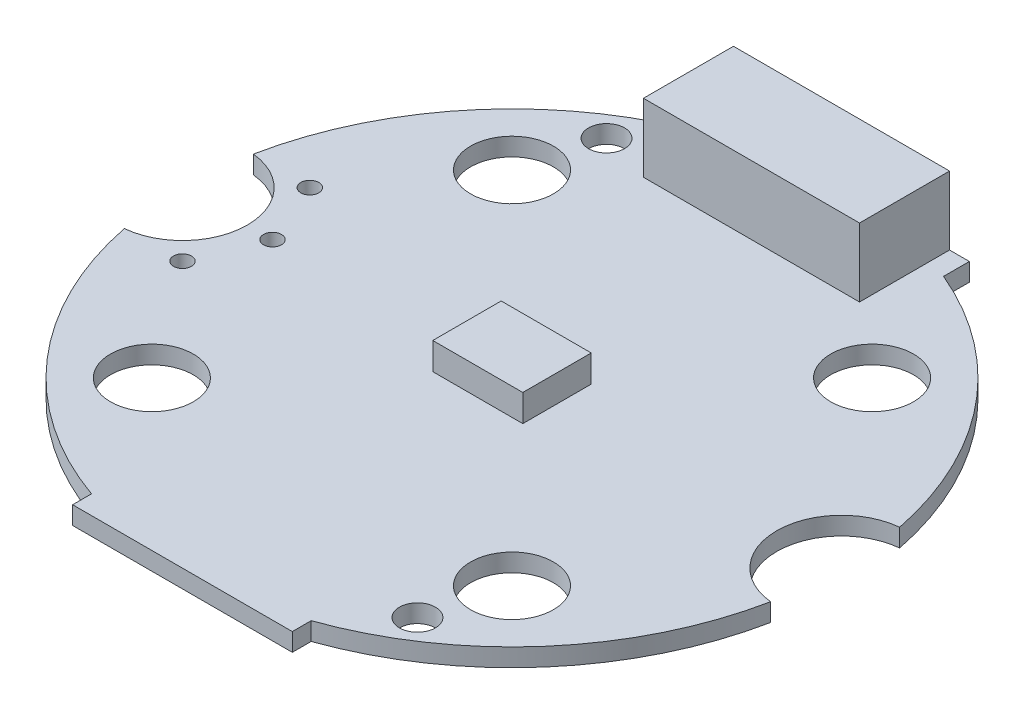
ISO-10303-21;
HEADER;
FILE_DESCRIPTION(('STEP AP214'),'2;1');
FILE_NAME('part.step','',(''),(''),'','','');
FILE_SCHEMA(('AUTOMOTIVE_DESIGN { 1 0 10303 214 1 1 1 1 }'));
ENDSEC;
DATA;
#1=APPLICATION_CONTEXT('core data for automotive mechanical design processes');
#2=APPLICATION_PROTOCOL_DEFINITION('international standard','automotive_design',2000,#1);
#3=PRODUCT_CONTEXT('',#1,'mechanical');
#4=PRODUCT('Part','Part','',(#3));
#5=PRODUCT_RELATED_PRODUCT_CATEGORY('part','',(#4));
#6=PRODUCT_DEFINITION_FORMATION('','',#4);
#7=PRODUCT_DEFINITION_CONTEXT('part definition',#1,'design');
#8=PRODUCT_DEFINITION('design','',#6,#7);
#9=PRODUCT_DEFINITION_SHAPE('','',#8);
#10=(LENGTH_UNIT() NAMED_UNIT(*) SI_UNIT(.MILLI.,.METRE.));
#11=(NAMED_UNIT(*) PLANE_ANGLE_UNIT() SI_UNIT($,.RADIAN.));
#12=(NAMED_UNIT(*) SI_UNIT($,.STERADIAN.) SOLID_ANGLE_UNIT());
#13=UNCERTAINTY_MEASURE_WITH_UNIT(LENGTH_MEASURE(1.E-05),#10,'distance_accuracy_value','');
#14=(GEOMETRIC_REPRESENTATION_CONTEXT(3) GLOBAL_UNCERTAINTY_ASSIGNED_CONTEXT((#13)) GLOBAL_UNIT_ASSIGNED_CONTEXT((#10,
#11,#12)) REPRESENTATION_CONTEXT('',''));
#15=CARTESIAN_POINT('',(0.,0.,0.));
#16=DIRECTION('',(0.,0.,1.));
#17=DIRECTION('',(1.,0.,0.));
#18=AXIS2_PLACEMENT_3D('',#15,#16,#17);
#19=CARTESIAN_POINT('',(0.,0.,0.));
#20=DIRECTION('',(0.,1.,0.));
#21=DIRECTION('',(0.,0.,1.));
#22=AXIS2_PLACEMENT_3D('',#19,#20,#21);
#23=PLANE('',#22);
#24=CARTESIAN_POINT('',(-13.3,0.,0.));
#25=DIRECTION('',(0.,-1.,0.));
#26=DIRECTION('',(0.,0.,-1.));
#27=AXIS2_PLACEMENT_3D('',#24,#25,#26);
#28=CIRCLE('',#27,0.500000000000001);
#29=CARTESIAN_POINT('',(-13.3,0.,-0.500000000000001));
#30=VERTEX_POINT('',#29);
#31=EDGE_CURVE('E400',#30,#30,#28,.T.);
#32=ORIENTED_EDGE('',*,*,#31,.F.);
#33=EDGE_LOOP('',(#32));
#34=FACE_BOUND('',#33,.T.);
#35=CARTESIAN_POINT('',(-14.7644660940673,0.,3.53553390593274));
#36=DIRECTION('',(0.,-1.,0.));
#37=DIRECTION('',(0.,0.,-1.));
#38=AXIS2_PLACEMENT_3D('',#35,#36,#37);
#39=CIRCLE('',#38,0.5);
#40=CARTESIAN_POINT('',(-14.7644660940673,0.,3.03553390593274));
#41=VERTEX_POINT('',#40);
#42=EDGE_CURVE('E766',#41,#41,#39,.T.);
#43=ORIENTED_EDGE('',*,*,#42,.F.);
#44=EDGE_LOOP('',(#43));
#45=FACE_BOUND('',#44,.T.);
#46=CARTESIAN_POINT('',(-14.7644660940673,0.,-3.53553390593274));
#47=DIRECTION('',(0.,-1.,0.));
#48=DIRECTION('',(0.,0.,-1.));
#49=AXIS2_PLACEMENT_3D('',#46,#47,#48);
#50=CIRCLE('',#49,0.500000000000001);
#51=CARTESIAN_POINT('',(-14.7644660940673,0.,-4.03553390593275));
#52=VERTEX_POINT('',#51);
#53=EDGE_CURVE('E767',#52,#52,#50,.T.);
#54=ORIENTED_EDGE('',*,*,#53,.F.);
#55=EDGE_LOOP('',(#54));
#56=FACE_BOUND('',#55,.T.);
#57=CARTESIAN_POINT('',(8.9,0.,14.15));
#58=DIRECTION('',(0.,1.,0.));
#59=DIRECTION('',(0.,0.,1.));
#60=AXIS2_PLACEMENT_3D('',#57,#58,#59);
#61=CIRCLE('',#60,0.999999999999999);
#62=CARTESIAN_POINT('',(8.9,0.,15.15));
#63=VERTEX_POINT('',#62);
#64=EDGE_CURVE('E396',#63,#63,#61,.T.);
#65=ORIENTED_EDGE('',*,*,#64,.T.);
#66=EDGE_LOOP('',(#65));
#67=FACE_BOUND('',#66,.T.);
#68=CARTESIAN_POINT('',(-8.9,0.,-14.15));
#69=DIRECTION('',(0.,1.,0.));
#70=DIRECTION('',(0.,0.,1.));
#71=AXIS2_PLACEMENT_3D('',#68,#69,#70);
#72=CIRCLE('',#71,0.999999999999999);
#73=CARTESIAN_POINT('',(-8.9,0.,-13.15));
#74=VERTEX_POINT('',#73);
#75=EDGE_CURVE('E392',#74,#74,#72,.T.);
#76=ORIENTED_EDGE('',*,*,#75,.T.);
#77=EDGE_LOOP('',(#76));
#78=FACE_BOUND('',#77,.T.);
#79=CARTESIAN_POINT('',(-9.99999999999943,0.,10.));
#80=DIRECTION('',(0.,1.,0.));
#81=DIRECTION('',(0.,0.,1.));
#82=AXIS2_PLACEMENT_3D('',#79,#80,#81);
#83=CIRCLE('',#82,2.3);
#84=CARTESIAN_POINT('',(-9.99999999999943,0.,12.3));
#85=VERTEX_POINT('',#84);
#86=EDGE_CURVE('E282',#85,#85,#83,.T.);
#87=ORIENTED_EDGE('',*,*,#86,.T.);
#88=EDGE_LOOP('',(#87));
#89=FACE_BOUND('',#88,.T.);
#90=CARTESIAN_POINT('',(10.0000000000006,0.,9.99999999999943));
#91=DIRECTION('',(0.,1.,0.));
#92=DIRECTION('',(0.,0.,1.));
#93=AXIS2_PLACEMENT_3D('',#90,#91,#92);
#94=CIRCLE('',#93,2.3);
#95=CARTESIAN_POINT('',(10.0000000000006,0.,12.2999999999994));
#96=VERTEX_POINT('',#95);
#97=EDGE_CURVE('E286',#96,#96,#94,.T.);
#98=ORIENTED_EDGE('',*,*,#97,.T.);
#99=EDGE_LOOP('',(#98));
#100=FACE_BOUND('',#99,.T.);
#101=CARTESIAN_POINT('',(10.,0.,-10.0000000000006));
#102=DIRECTION('',(0.,1.,0.));
#103=DIRECTION('',(0.,0.,1.));
#104=AXIS2_PLACEMENT_3D('',#101,#102,#103);
#105=CIRCLE('',#104,2.3);
#106=CARTESIAN_POINT('',(10.,0.,-7.70000000000057));
#107=VERTEX_POINT('',#106);
#108=EDGE_CURVE('E292',#107,#107,#105,.T.);
#109=ORIENTED_EDGE('',*,*,#108,.T.);
#110=EDGE_LOOP('',(#109));
#111=FACE_BOUND('',#110,.T.);
#112=CARTESIAN_POINT('',(-10.,0.,-10.));
#113=DIRECTION('',(0.,1.,0.));
#114=DIRECTION('',(0.,0.,1.));
#115=AXIS2_PLACEMENT_3D('',#112,#113,#114);
#116=CIRCLE('',#115,2.3);
#117=CARTESIAN_POINT('',(-10.,0.,-7.7));
#118=VERTEX_POINT('',#117);
#119=EDGE_CURVE('E298',#118,#118,#116,.T.);
#120=ORIENTED_EDGE('',*,*,#119,.T.);
#121=EDGE_LOOP('',(#120));
#122=FACE_BOUND('',#121,.T.);
#123=CARTESIAN_POINT('',(0.,0.,0.));
#124=DIRECTION('',(0.,1.,0.));
#125=DIRECTION('',(0.,0.,1.));
#126=AXIS2_PLACEMENT_3D('',#123,#124,#125);
#127=CIRCLE('',#126,18.3);
#128=CARTESIAN_POINT('',(6.1,0.,17.2534054609518));
#129=VERTEX_POINT('',#128);
#130=CARTESIAN_POINT('',(17.9459016393443,0.,3.58254300057667));
#131=VERTEX_POINT('',#130);
#132=EDGE_CURVE('E304',#129,#131,#127,.T.);
#133=ORIENTED_EDGE('',*,*,#132,.F.);
#134=DIRECTION('',(0.,0.,-1.));
#135=VECTOR('',#134,1.);
#136=CARTESIAN_POINT('',(6.1,0.,17.2534054609518));
#137=LINE('',#136,#135);
#138=CARTESIAN_POINT('',(6.1,0.,18.3));
#139=VERTEX_POINT('',#138);
#140=EDGE_CURVE('E311',#139,#129,#137,.T.);
#141=ORIENTED_EDGE('',*,*,#140,.F.);
#142=DIRECTION('',(1.,0.,0.));
#143=VECTOR('',#142,1.);
#144=CARTESIAN_POINT('',(6.1,0.,18.3));
#145=LINE('',#144,#143);
#146=CARTESIAN_POINT('',(-6.1,0.,18.3));
#147=VERTEX_POINT('',#146);
#148=EDGE_CURVE('E355',#147,#139,#145,.T.);
#149=ORIENTED_EDGE('',*,*,#148,.F.);
#150=DIRECTION('',(0.,0.,1.));
#151=VECTOR('',#150,1.);
#152=CARTESIAN_POINT('',(-6.1,0.,18.3));
#153=LINE('',#152,#151);
#154=CARTESIAN_POINT('',(-6.1,0.,17.2534054609518));
#155=VERTEX_POINT('',#154);
#156=EDGE_CURVE('E353',#155,#147,#153,.T.);
#157=ORIENTED_EDGE('',*,*,#156,.F.);
#158=CARTESIAN_POINT('',(0.,0.,0.));
#159=DIRECTION('',(0.,1.,0.));
#160=DIRECTION('',(0.,0.,1.));
#161=AXIS2_PLACEMENT_3D('',#158,#159,#160);
#162=CIRCLE('',#161,18.3);
#163=CARTESIAN_POINT('',(-17.9459016393443,0.,3.58254300057667));
#164=VERTEX_POINT('',#163);
#165=EDGE_CURVE('E351',#164,#155,#162,.T.);
#166=ORIENTED_EDGE('',*,*,#165,.F.);
#167=CARTESIAN_POINT('',(-18.3,0.,0.));
#168=DIRECTION('',(0.,-1.,0.));
#169=DIRECTION('',(0.,0.,1.));
#170=AXIS2_PLACEMENT_3D('',#167,#168,#169);
#171=CIRCLE('',#170,3.6);
#172=CARTESIAN_POINT('',(-17.9459016393443,0.,-3.58254300057668));
#173=VERTEX_POINT('',#172);
#174=EDGE_CURVE('E349',#173,#164,#171,.T.);
#175=ORIENTED_EDGE('',*,*,#174,.F.);
#176=CARTESIAN_POINT('',(0.,0.,0.));
#177=DIRECTION('',(0.,1.,0.));
#178=DIRECTION('',(0.,0.,1.));
#179=AXIS2_PLACEMENT_3D('',#176,#177,#178);
#180=CIRCLE('',#179,18.3);
#181=CARTESIAN_POINT('',(-7.1,0.,-16.8665349138464));
#182=VERTEX_POINT('',#181);
#183=EDGE_CURVE('E347',#182,#173,#180,.T.);
#184=ORIENTED_EDGE('',*,*,#183,.F.);
#185=DIRECTION('',(0.,0.,1.));
#186=VECTOR('',#185,1.);
#187=CARTESIAN_POINT('',(-7.1,0.,-18.3));
#188=LINE('',#187,#186);
#189=CARTESIAN_POINT('',(-7.1,0.,-18.3));
#190=VERTEX_POINT('',#189);
#191=EDGE_CURVE('E345',#190,#182,#188,.T.);
#192=ORIENTED_EDGE('',*,*,#191,.F.);
#193=DIRECTION('',(-1.,0.,0.));
#194=VECTOR('',#193,1.);
#195=CARTESIAN_POINT('',(-7.1,0.,-18.3));
#196=LINE('',#195,#194);
#197=CARTESIAN_POINT('',(7.1,0.,-18.3));
#198=VERTEX_POINT('',#197);
#199=EDGE_CURVE('E343',#198,#190,#196,.T.);
#200=ORIENTED_EDGE('',*,*,#199,.F.);
#201=DIRECTION('',(0.,0.,-1.));
#202=VECTOR('',#201,1.);
#203=CARTESIAN_POINT('',(7.1,0.,-18.3));
#204=LINE('',#203,#202);
#205=CARTESIAN_POINT('',(7.1,0.,-16.8665349138464));
#206=VERTEX_POINT('',#205);
#207=EDGE_CURVE('E341',#206,#198,#204,.T.);
#208=ORIENTED_EDGE('',*,*,#207,.F.);
#209=CARTESIAN_POINT('',(0.,0.,0.));
#210=DIRECTION('',(0.,1.,0.));
#211=DIRECTION('',(0.,0.,1.));
#212=AXIS2_PLACEMENT_3D('',#209,#210,#211);
#213=CIRCLE('',#212,18.3);
#214=CARTESIAN_POINT('',(17.9459016393443,0.,-3.58254300057667));
#215=VERTEX_POINT('',#214);
#216=EDGE_CURVE('E339',#215,#206,#213,.T.);
#217=ORIENTED_EDGE('',*,*,#216,.F.);
#218=CARTESIAN_POINT('',(18.3,0.,0.));
#219=DIRECTION('',(0.,-1.,0.));
#220=DIRECTION('',(0.,0.,1.));
#221=AXIS2_PLACEMENT_3D('',#218,#219,#220);
#222=CIRCLE('',#221,3.6);
#223=EDGE_CURVE('E337',#131,#215,#222,.T.);
#224=ORIENTED_EDGE('',*,*,#223,.F.);
#225=EDGE_LOOP('',(#133,#141,#149,#157,#166,#175,#184,#192,#200,#208,#217,#224));
#226=FACE_BOUND('',#225,.T.);
#227=DIRECTION('',(0.,0.,1.));
#228=VECTOR('',#227,1.);
#229=CARTESIAN_POINT('',(3.,0.,11.8));
#230=LINE('',#229,#228);
#231=CARTESIAN_POINT('',(3.,0.,4.7));
#232=VERTEX_POINT('',#231);
#233=CARTESIAN_POINT('',(3.,0.,11.8));
#234=VERTEX_POINT('',#233);
#235=EDGE_CURVE('E217',#232,#234,#230,.T.);
#236=ORIENTED_EDGE('',*,*,#235,.F.);
#237=DIRECTION('',(1.,0.,0.));
#238=VECTOR('',#237,1.);
#239=CARTESIAN_POINT('',(-3.,0.,4.7));
#240=LINE('',#239,#238);
#241=CARTESIAN_POINT('',(-3.,0.,4.7));
#242=VERTEX_POINT('',#241);
#243=EDGE_CURVE('E214',#242,#232,#240,.T.);
#244=ORIENTED_EDGE('',*,*,#243,.F.);
#245=DIRECTION('',(0.,0.,-1.));
#246=VECTOR('',#245,1.);
#247=CARTESIAN_POINT('',(-3.,0.,11.8));
#248=LINE('',#247,#246);
#249=CARTESIAN_POINT('',(-3.,0.,11.8));
#250=VERTEX_POINT('',#249);
#251=EDGE_CURVE('E56',#250,#242,#248,.T.);
#252=ORIENTED_EDGE('',*,*,#251,.F.);
#253=DIRECTION('',(-1.,0.,0.));
#254=VECTOR('',#253,1.);
#255=CARTESIAN_POINT('',(-3.,0.,11.8));
#256=LINE('',#255,#254);
#257=EDGE_CURVE('E51',#234,#250,#256,.T.);
#258=ORIENTED_EDGE('',*,*,#257,.F.);
#259=EDGE_LOOP('',(#236,#244,#252,#258));
#260=FACE_BOUND('',#259,.T.);
#261=ADVANCED_FACE('F34',(#34,#45,#56,#67,#78,#89,#100,#111,#122,#226,#260),#23,.F.);
#262=CARTESIAN_POINT('',(0.,1.,0.));
#263=DIRECTION('',(0.,1.,0.));
#264=DIRECTION('',(0.,0.,1.));
#265=AXIS2_PLACEMENT_3D('',#262,#263,#264);
#266=PLANE('',#265);
#267=CARTESIAN_POINT('',(-13.3,1.,0.));
#268=DIRECTION('',(0.,1.,0.));
#269=DIRECTION('',(0.,0.,1.));
#270=AXIS2_PLACEMENT_3D('',#267,#268,#269);
#271=CIRCLE('',#270,0.500000000000001);
#272=CARTESIAN_POINT('',(-13.3,1.,0.500000000000001));
#273=VERTEX_POINT('',#272);
#274=EDGE_CURVE('E38',#273,#273,#271,.T.);
#275=ORIENTED_EDGE('',*,*,#274,.F.);
#276=EDGE_LOOP('',(#275));
#277=FACE_BOUND('',#276,.T.);
#278=CARTESIAN_POINT('',(-14.7644660940673,1.,3.53553390593274));
#279=DIRECTION('',(0.,1.,0.));
#280=DIRECTION('',(0.,0.,1.));
#281=AXIS2_PLACEMENT_3D('',#278,#279,#280);
#282=CIRCLE('',#281,0.5);
#283=CARTESIAN_POINT('',(-14.7644660940673,1.,4.03553390593274));
#284=VERTEX_POINT('',#283);
#285=EDGE_CURVE('E399',#284,#284,#282,.T.);
#286=ORIENTED_EDGE('',*,*,#285,.F.);
#287=EDGE_LOOP('',(#286));
#288=FACE_BOUND('',#287,.T.);
#289=CARTESIAN_POINT('',(-14.7644660940673,1.,-3.53553390593274));
#290=DIRECTION('',(0.,1.,0.));
#291=DIRECTION('',(0.,0.,1.));
#292=AXIS2_PLACEMENT_3D('',#289,#290,#291);
#293=CIRCLE('',#292,0.500000000000001);
#294=CARTESIAN_POINT('',(-14.7644660940673,1.,-3.03553390593274));
#295=VERTEX_POINT('',#294);
#296=EDGE_CURVE('E397',#295,#295,#293,.T.);
#297=ORIENTED_EDGE('',*,*,#296,.F.);
#298=EDGE_LOOP('',(#297));
#299=FACE_BOUND('',#298,.T.);
#300=CARTESIAN_POINT('',(8.9,1.,14.15));
#301=DIRECTION('',(0.,1.,0.));
#302=DIRECTION('',(0.,0.,1.));
#303=AXIS2_PLACEMENT_3D('',#300,#301,#302);
#304=CIRCLE('',#303,0.999999999999999);
#305=CARTESIAN_POINT('',(8.9,1.,15.15));
#306=VERTEX_POINT('',#305);
#307=EDGE_CURVE('E393',#306,#306,#304,.T.);
#308=ORIENTED_EDGE('',*,*,#307,.F.);
#309=EDGE_LOOP('',(#308));
#310=FACE_BOUND('',#309,.T.);
#311=CARTESIAN_POINT('',(-8.9,1.,-14.15));
#312=DIRECTION('',(0.,1.,0.));
#313=DIRECTION('',(0.,0.,1.));
#314=AXIS2_PLACEMENT_3D('',#311,#312,#313);
#315=CIRCLE('',#314,0.999999999999999);
#316=CARTESIAN_POINT('',(-8.9,1.,-13.15));
#317=VERTEX_POINT('',#316);
#318=EDGE_CURVE('E389',#317,#317,#315,.T.);
#319=ORIENTED_EDGE('',*,*,#318,.F.);
#320=EDGE_LOOP('',(#319));
#321=FACE_BOUND('',#320,.T.);
#322=DIRECTION('',(0.,0.,1.));
#323=VECTOR('',#322,1.);
#324=CARTESIAN_POINT('',(-6.,1.,-18.3));
#325=LINE('',#324,#323);
#326=CARTESIAN_POINT('',(-6.,1.,-18.3));
#327=VERTEX_POINT('',#326);
#328=CARTESIAN_POINT('',(-6.,1.,-13.3));
#329=VERTEX_POINT('',#328);
#330=EDGE_CURVE('E252',#327,#329,#325,.T.);
#331=ORIENTED_EDGE('',*,*,#330,.F.);
#332=DIRECTION('',(-1.,0.,0.));
#333=VECTOR('',#332,1.);
#334=CARTESIAN_POINT('',(-7.1,1.,-18.3));
#335=LINE('',#334,#333);
#336=CARTESIAN_POINT('',(-7.1,1.,-18.3));
#337=VERTEX_POINT('',#336);
#338=EDGE_CURVE('E317',#327,#337,#335,.T.);
#339=ORIENTED_EDGE('',*,*,#338,.T.);
#340=DIRECTION('',(0.,0.,1.));
#341=VECTOR('',#340,1.);
#342=CARTESIAN_POINT('',(-7.1,1.,-18.3));
#343=LINE('',#342,#341);
#344=CARTESIAN_POINT('',(-7.1,1.,-16.8665349138464));
#345=VERTEX_POINT('',#344);
#346=EDGE_CURVE('E320',#337,#345,#343,.T.);
#347=ORIENTED_EDGE('',*,*,#346,.T.);
#348=CARTESIAN_POINT('',(0.,1.,0.));
#349=DIRECTION('',(0.,1.,0.));
#350=DIRECTION('',(0.,0.,1.));
#351=AXIS2_PLACEMENT_3D('',#348,#349,#350);
#352=CIRCLE('',#351,18.3);
#353=CARTESIAN_POINT('',(-17.9459016393443,1.,-3.58254300057668));
#354=VERTEX_POINT('',#353);
#355=EDGE_CURVE('E322',#345,#354,#352,.T.);
#356=ORIENTED_EDGE('',*,*,#355,.T.);
#357=CARTESIAN_POINT('',(-18.3,1.,0.));
#358=DIRECTION('',(0.,-1.,0.));
#359=DIRECTION('',(0.,0.,1.));
#360=AXIS2_PLACEMENT_3D('',#357,#358,#359);
#361=CIRCLE('',#360,3.6);
#362=CARTESIAN_POINT('',(-17.9459016393443,1.,3.58254300057667));
#363=VERTEX_POINT('',#362);
#364=EDGE_CURVE('E324',#354,#363,#361,.T.);
#365=ORIENTED_EDGE('',*,*,#364,.T.);
#366=CARTESIAN_POINT('',(0.,1.,0.));
#367=DIRECTION('',(0.,1.,0.));
#368=DIRECTION('',(0.,0.,1.));
#369=AXIS2_PLACEMENT_3D('',#366,#367,#368);
#370=CIRCLE('',#369,18.3);
#371=CARTESIAN_POINT('',(-6.1,1.,17.2534054609518));
#372=VERTEX_POINT('',#371);
#373=EDGE_CURVE('E326',#363,#372,#370,.T.);
#374=ORIENTED_EDGE('',*,*,#373,.T.);
#375=DIRECTION('',(0.,0.,1.));
#376=VECTOR('',#375,1.);
#377=CARTESIAN_POINT('',(-6.1,1.,18.3));
#378=LINE('',#377,#376);
#379=CARTESIAN_POINT('',(-6.1,1.,18.3));
#380=VERTEX_POINT('',#379);
#381=EDGE_CURVE('E328',#372,#380,#378,.T.);
#382=ORIENTED_EDGE('',*,*,#381,.T.);
#383=DIRECTION('',(1.,0.,0.));
#384=VECTOR('',#383,1.);
#385=CARTESIAN_POINT('',(6.1,1.,18.3));
#386=LINE('',#385,#384);
#387=CARTESIAN_POINT('',(6.1,1.,18.3));
#388=VERTEX_POINT('',#387);
#389=EDGE_CURVE('E330',#380,#388,#386,.T.);
#390=ORIENTED_EDGE('',*,*,#389,.T.);
#391=DIRECTION('',(0.,0.,-1.));
#392=VECTOR('',#391,1.);
#393=CARTESIAN_POINT('',(6.1,1.,17.2534054609518));
#394=LINE('',#393,#392);
#395=CARTESIAN_POINT('',(6.1,1.,17.2534054609518));
#396=VERTEX_POINT('',#395);
#397=EDGE_CURVE('E332',#388,#396,#394,.T.);
#398=ORIENTED_EDGE('',*,*,#397,.T.);
#399=CARTESIAN_POINT('',(0.,1.,0.));
#400=DIRECTION('',(0.,1.,0.));
#401=DIRECTION('',(0.,0.,1.));
#402=AXIS2_PLACEMENT_3D('',#399,#400,#401);
#403=CIRCLE('',#402,18.3);
#404=CARTESIAN_POINT('',(17.9459016393443,1.,3.58254300057667));
#405=VERTEX_POINT('',#404);
#406=EDGE_CURVE('E307',#396,#405,#403,.T.);
#407=ORIENTED_EDGE('',*,*,#406,.T.);
#408=CARTESIAN_POINT('',(18.3,1.,0.));
#409=DIRECTION('',(0.,-1.,0.));
#410=DIRECTION('',(0.,0.,1.));
#411=AXIS2_PLACEMENT_3D('',#408,#409,#410);
#412=CIRCLE('',#411,3.6);
#413=CARTESIAN_POINT('',(17.9459016393443,1.,-3.58254300057667));
#414=VERTEX_POINT('',#413);
#415=EDGE_CURVE('E310',#405,#414,#412,.T.);
#416=ORIENTED_EDGE('',*,*,#415,.T.);
#417=CARTESIAN_POINT('',(0.,1.,0.));
#418=DIRECTION('',(0.,1.,0.));
#419=DIRECTION('',(0.,0.,1.));
#420=AXIS2_PLACEMENT_3D('',#417,#418,#419);
#421=CIRCLE('',#420,18.3);
#422=CARTESIAN_POINT('',(7.1,1.,-16.8665349138464));
#423=VERTEX_POINT('',#422);
#424=EDGE_CURVE('E313',#414,#423,#421,.T.);
#425=ORIENTED_EDGE('',*,*,#424,.T.);
#426=DIRECTION('',(0.,0.,-1.));
#427=VECTOR('',#426,1.);
#428=CARTESIAN_POINT('',(7.1,1.,-18.3));
#429=LINE('',#428,#427);
#430=CARTESIAN_POINT('',(7.1,1.,-18.3));
#431=VERTEX_POINT('',#430);
#432=EDGE_CURVE('E315',#423,#431,#429,.T.);
#433=ORIENTED_EDGE('',*,*,#432,.T.);
#434=CARTESIAN_POINT('',(6.,1.,-18.3));
#435=VERTEX_POINT('',#434);
#436=EDGE_CURVE('E318',#431,#435,#335,.T.);
#437=ORIENTED_EDGE('',*,*,#436,.T.);
#438=DIRECTION('',(0.,0.,-1.));
#439=VECTOR('',#438,1.);
#440=CARTESIAN_POINT('',(6.,1.,-18.3));
#441=LINE('',#440,#439);
#442=CARTESIAN_POINT('',(6.,1.,-13.3));
#443=VERTEX_POINT('',#442);
#444=EDGE_CURVE('E257',#443,#435,#441,.T.);
#445=ORIENTED_EDGE('',*,*,#444,.F.);
#446=DIRECTION('',(1.,0.,0.));
#447=VECTOR('',#446,1.);
#448=CARTESIAN_POINT('',(-6.,1.,-13.3));
#449=LINE('',#448,#447);
#450=EDGE_CURVE('E266',#329,#443,#449,.T.);
#451=ORIENTED_EDGE('',*,*,#450,.F.);
#452=EDGE_LOOP('',(#331,#339,#347,#356,#365,#374,#382,#390,#398,#407,#416,#425,#433,#437,#445,#451));
#453=FACE_BOUND('',#452,.T.);
#454=CARTESIAN_POINT('',(10.0000000000006,1.,9.99999999999943));
#455=DIRECTION('',(0.,1.,0.));
#456=DIRECTION('',(0.,0.,1.));
#457=AXIS2_PLACEMENT_3D('',#454,#455,#456);
#458=CIRCLE('',#457,2.3);
#459=CARTESIAN_POINT('',(10.0000000000006,1.,12.2999999999994));
#460=VERTEX_POINT('',#459);
#461=EDGE_CURVE('E289',#460,#460,#458,.T.);
#462=ORIENTED_EDGE('',*,*,#461,.F.);
#463=EDGE_LOOP('',(#462));
#464=FACE_BOUND('',#463,.T.);
#465=CARTESIAN_POINT('',(-10.,1.,-10.));
#466=DIRECTION('',(0.,1.,0.));
#467=DIRECTION('',(0.,0.,1.));
#468=AXIS2_PLACEMENT_3D('',#465,#466,#467);
#469=CIRCLE('',#468,2.3);
#470=CARTESIAN_POINT('',(-10.,1.,-7.7));
#471=VERTEX_POINT('',#470);
#472=EDGE_CURVE('E301',#471,#471,#469,.T.);
#473=ORIENTED_EDGE('',*,*,#472,.F.);
#474=EDGE_LOOP('',(#473));
#475=FACE_BOUND('',#474,.T.);
#476=CARTESIAN_POINT('',(10.,1.,-10.0000000000006));
#477=DIRECTION('',(0.,1.,0.));
#478=DIRECTION('',(0.,0.,1.));
#479=AXIS2_PLACEMENT_3D('',#476,#477,#478);
#480=CIRCLE('',#479,2.3);
#481=CARTESIAN_POINT('',(10.,1.,-7.70000000000057));
#482=VERTEX_POINT('',#481);
#483=EDGE_CURVE('E295',#482,#482,#480,.T.);
#484=ORIENTED_EDGE('',*,*,#483,.F.);
#485=EDGE_LOOP('',(#484));
#486=FACE_BOUND('',#485,.T.);
#487=CARTESIAN_POINT('',(-9.99999999999943,1.,10.));
#488=DIRECTION('',(0.,1.,0.));
#489=DIRECTION('',(0.,0.,1.));
#490=AXIS2_PLACEMENT_3D('',#487,#488,#489);
#491=CIRCLE('',#490,2.3);
#492=CARTESIAN_POINT('',(-9.99999999999943,1.,12.3));
#493=VERTEX_POINT('',#492);
#494=EDGE_CURVE('E283',#493,#493,#491,.T.);
#495=ORIENTED_EDGE('',*,*,#494,.F.);
#496=EDGE_LOOP('',(#495));
#497=FACE_BOUND('',#496,.T.);
#498=DIRECTION('',(-1.,0.,0.));
#499=VECTOR('',#498,1.);
#500=CARTESIAN_POINT('',(-2.5,1.,-1.9));
#501=LINE('',#500,#499);
#502=CARTESIAN_POINT('',(2.5,1.,-1.9));
#503=VERTEX_POINT('',#502);
#504=CARTESIAN_POINT('',(-2.5,1.,-1.9));
#505=VERTEX_POINT('',#504);
#506=EDGE_CURVE('E221',#503,#505,#501,.T.);
#507=ORIENTED_EDGE('',*,*,#506,.F.);
#508=DIRECTION('',(0.,0.,-1.));
#509=VECTOR('',#508,1.);
#510=CARTESIAN_POINT('',(2.5,1.,-1.9));
#511=LINE('',#510,#509);
#512=CARTESIAN_POINT('',(2.5,1.,1.9));
#513=VERTEX_POINT('',#512);
#514=EDGE_CURVE('E218',#513,#503,#511,.T.);
#515=ORIENTED_EDGE('',*,*,#514,.F.);
#516=DIRECTION('',(1.,0.,0.));
#517=VECTOR('',#516,1.);
#518=CARTESIAN_POINT('',(-2.5,1.,1.9));
#519=LINE('',#518,#517);
#520=CARTESIAN_POINT('',(-2.5,1.,1.9));
#521=VERTEX_POINT('',#520);
#522=EDGE_CURVE('E231',#521,#513,#519,.T.);
#523=ORIENTED_EDGE('',*,*,#522,.F.);
#524=DIRECTION('',(0.,0.,1.));
#525=VECTOR('',#524,1.);
#526=CARTESIAN_POINT('',(-2.5,1.,-1.9));
#527=LINE('',#526,#525);
#528=EDGE_CURVE('E239',#505,#521,#527,.T.);
#529=ORIENTED_EDGE('',*,*,#528,.F.);
#530=EDGE_LOOP('',(#507,#515,#523,#529));
#531=FACE_BOUND('',#530,.T.);
#532=ADVANCED_FACE('F410',(#277,#288,#299,#310,#321,#453,#464,#475,#486,#497,#531),#266,.T.);
#533=CARTESIAN_POINT('',(0.,1.,0.));
#534=DIRECTION('',(0.,-1.,0.));
#535=DIRECTION('',(0.,0.,-1.));
#536=AXIS2_PLACEMENT_3D('',#533,#534,#535);
#537=CYLINDRICAL_SURFACE('',#536,18.3);
#538=ORIENTED_EDGE('',*,*,#132,.T.);
#539=DIRECTION('',(0.,-1.,0.));
#540=VECTOR('',#539,1.);
#541=CARTESIAN_POINT('',(17.9459016393443,1.,3.58254300057667));
#542=LINE('',#541,#540);
#543=EDGE_CURVE('E11',#405,#131,#542,.T.);
#544=ORIENTED_EDGE('',*,*,#543,.F.);
#545=ORIENTED_EDGE('',*,*,#406,.F.);
#546=DIRECTION('',(0.,-1.,0.));
#547=VECTOR('',#546,1.);
#548=CARTESIAN_POINT('',(6.1,1.,17.2534054609518));
#549=LINE('',#548,#547);
#550=EDGE_CURVE('E334',#396,#129,#549,.T.);
#551=ORIENTED_EDGE('',*,*,#550,.T.);
#552=EDGE_LOOP('',(#538,#544,#545,#551));
#553=FACE_BOUND('',#552,.T.);
#554=ADVANCED_FACE('F36',(#553),#537,.T.);
#555=CARTESIAN_POINT('',(18.3,1.,0.));
#556=DIRECTION('',(0.,-1.,0.));
#557=DIRECTION('',(0.,0.,-1.));
#558=AXIS2_PLACEMENT_3D('',#555,#556,#557);
#559=CYLINDRICAL_SURFACE('',#558,3.6);
#560=ORIENTED_EDGE('',*,*,#223,.T.);
#561=DIRECTION('',(0.,-1.,0.));
#562=VECTOR('',#561,1.);
#563=CARTESIAN_POINT('',(17.9459016393443,1.,-3.58254300057667));
#564=LINE('',#563,#562);
#565=EDGE_CURVE('E43',#414,#215,#564,.T.);
#566=ORIENTED_EDGE('',*,*,#565,.F.);
#567=ORIENTED_EDGE('',*,*,#415,.F.);
#568=ORIENTED_EDGE('',*,*,#543,.T.);
#569=EDGE_LOOP('',(#560,#566,#567,#568));
#570=FACE_BOUND('',#569,.T.);
#571=ADVANCED_FACE('F508',(#570),#559,.F.);
#572=CARTESIAN_POINT('',(0.,1.,0.));
#573=DIRECTION('',(0.,-1.,0.));
#574=DIRECTION('',(0.,0.,-1.));
#575=AXIS2_PLACEMENT_3D('',#572,#573,#574);
#576=CYLINDRICAL_SURFACE('',#575,18.3);
#577=ORIENTED_EDGE('',*,*,#216,.T.);
#578=DIRECTION('',(0.,-1.,0.));
#579=VECTOR('',#578,1.);
#580=CARTESIAN_POINT('',(7.1,1.,-16.8665349138464));
#581=LINE('',#580,#579);
#582=EDGE_CURVE('E384',#423,#206,#581,.T.);
#583=ORIENTED_EDGE('',*,*,#582,.F.);
#584=ORIENTED_EDGE('',*,*,#424,.F.);
#585=ORIENTED_EDGE('',*,*,#565,.T.);
#586=EDGE_LOOP('',(#577,#583,#584,#585));
#587=FACE_BOUND('',#586,.T.);
#588=ADVANCED_FACE('F505',(#587),#576,.T.);
#589=CARTESIAN_POINT('',(7.1,1.,-18.3));
#590=DIRECTION('',(-1.,0.,0.));
#591=DIRECTION('',(0.,0.,1.));
#592=AXIS2_PLACEMENT_3D('',#589,#590,#591);
#593=PLANE('',#592);
#594=ORIENTED_EDGE('',*,*,#207,.T.);
#595=DIRECTION('',(0.,-1.,0.));
#596=VECTOR('',#595,1.);
#597=CARTESIAN_POINT('',(7.1,1.,-18.3));
#598=LINE('',#597,#596);
#599=EDGE_CURVE('E381',#431,#198,#598,.T.);
#600=ORIENTED_EDGE('',*,*,#599,.F.);
#601=ORIENTED_EDGE('',*,*,#432,.F.);
#602=ORIENTED_EDGE('',*,*,#582,.T.);
#603=EDGE_LOOP('',(#594,#600,#601,#602));
#604=FACE_BOUND('',#603,.T.);
#605=ADVANCED_FACE('F501',(#604),#593,.F.);
#606=CARTESIAN_POINT('',(-7.1,1.,-18.3));
#607=DIRECTION('',(0.,0.,1.));
#608=DIRECTION('',(1.,0.,0.));
#609=AXIS2_PLACEMENT_3D('',#606,#607,#608);
#610=PLANE('',#609);
#611=ORIENTED_EDGE('',*,*,#199,.T.);
#612=DIRECTION('',(0.,-1.,0.));
#613=VECTOR('',#612,1.);
#614=CARTESIAN_POINT('',(-7.1,1.,-18.3));
#615=LINE('',#614,#613);
#616=EDGE_CURVE('E378',#337,#190,#615,.T.);
#617=ORIENTED_EDGE('',*,*,#616,.F.);
#618=ORIENTED_EDGE('',*,*,#338,.F.);
#619=DIRECTION('',(0.,-1.,0.));
#620=VECTOR('',#619,1.);
#621=CARTESIAN_POINT('',(-6.,4.8,-18.3));
#622=LINE('',#621,#620);
#623=CARTESIAN_POINT('',(-6.,4.8,-18.3));
#624=VERTEX_POINT('',#623);
#625=EDGE_CURVE('E263',#624,#327,#622,.T.);
#626=ORIENTED_EDGE('',*,*,#625,.F.);
#627=DIRECTION('',(-1.,0.,0.));
#628=VECTOR('',#627,1.);
#629=CARTESIAN_POINT('',(-6.,4.8,-18.3));
#630=LINE('',#629,#628);
#631=CARTESIAN_POINT('',(6.,4.8,-18.3));
#632=VERTEX_POINT('',#631);
#633=EDGE_CURVE('E261',#632,#624,#630,.T.);
#634=ORIENTED_EDGE('',*,*,#633,.F.);
#635=DIRECTION('',(0.,-1.,0.));
#636=VECTOR('',#635,1.);
#637=CARTESIAN_POINT('',(6.,4.8,-18.3));
#638=LINE('',#637,#636);
#639=EDGE_CURVE('E273',#632,#435,#638,.T.);
#640=ORIENTED_EDGE('',*,*,#639,.T.);
#641=ORIENTED_EDGE('',*,*,#436,.F.);
#642=ORIENTED_EDGE('',*,*,#599,.T.);
#643=EDGE_LOOP('',(#611,#617,#618,#626,#634,#640,#641,#642));
#644=FACE_BOUND('',#643,.T.);
#645=ADVANCED_FACE('F497',(#644),#610,.F.);
#646=CARTESIAN_POINT('',(-7.1,1.,-18.3));
#647=DIRECTION('',(1.,0.,0.));
#648=DIRECTION('',(0.,0.,-1.));
#649=AXIS2_PLACEMENT_3D('',#646,#647,#648);
#650=PLANE('',#649);
#651=ORIENTED_EDGE('',*,*,#191,.T.);
#652=DIRECTION('',(0.,-1.,0.));
#653=VECTOR('',#652,1.);
#654=CARTESIAN_POINT('',(-7.1,1.,-16.8665349138464));
#655=LINE('',#654,#653);
#656=EDGE_CURVE('E375',#345,#182,#655,.T.);
#657=ORIENTED_EDGE('',*,*,#656,.F.);
#658=ORIENTED_EDGE('',*,*,#346,.F.);
#659=ORIENTED_EDGE('',*,*,#616,.T.);
#660=EDGE_LOOP('',(#651,#657,#658,#659));
#661=FACE_BOUND('',#660,.T.);
#662=ADVANCED_FACE('F493',(#661),#650,.F.);
#663=CARTESIAN_POINT('',(0.,1.,0.));
#664=DIRECTION('',(0.,-1.,0.));
#665=DIRECTION('',(0.,0.,-1.));
#666=AXIS2_PLACEMENT_3D('',#663,#664,#665);
#667=CYLINDRICAL_SURFACE('',#666,18.3);
#668=ORIENTED_EDGE('',*,*,#183,.T.);
#669=DIRECTION('',(0.,-1.,0.));
#670=VECTOR('',#669,1.);
#671=CARTESIAN_POINT('',(-17.9459016393443,1.,-3.58254300057668));
#672=LINE('',#671,#670);
#673=EDGE_CURVE('E372',#354,#173,#672,.T.);
#674=ORIENTED_EDGE('',*,*,#673,.F.);
#675=ORIENTED_EDGE('',*,*,#355,.F.);
#676=ORIENTED_EDGE('',*,*,#656,.T.);
#677=EDGE_LOOP('',(#668,#674,#675,#676));
#678=FACE_BOUND('',#677,.T.);
#679=ADVANCED_FACE('F489',(#678),#667,.T.);
#680=CARTESIAN_POINT('',(-18.3,1.,0.));
#681=DIRECTION('',(0.,-1.,0.));
#682=DIRECTION('',(0.,0.,-1.));
#683=AXIS2_PLACEMENT_3D('',#680,#681,#682);
#684=CYLINDRICAL_SURFACE('',#683,3.6);
#685=ORIENTED_EDGE('',*,*,#174,.T.);
#686=DIRECTION('',(0.,-1.,0.));
#687=VECTOR('',#686,1.);
#688=CARTESIAN_POINT('',(-17.9459016393443,1.,3.58254300057667));
#689=LINE('',#688,#687);
#690=EDGE_CURVE('E369',#363,#164,#689,.T.);
#691=ORIENTED_EDGE('',*,*,#690,.F.);
#692=ORIENTED_EDGE('',*,*,#364,.F.);
#693=ORIENTED_EDGE('',*,*,#673,.T.);
#694=EDGE_LOOP('',(#685,#691,#692,#693));
#695=FACE_BOUND('',#694,.T.);
#696=ADVANCED_FACE('F485',(#695),#684,.F.);
#697=CARTESIAN_POINT('',(0.,1.,0.));
#698=DIRECTION('',(0.,-1.,0.));
#699=DIRECTION('',(0.,0.,-1.));
#700=AXIS2_PLACEMENT_3D('',#697,#698,#699);
#701=CYLINDRICAL_SURFACE('',#700,18.3);
#702=ORIENTED_EDGE('',*,*,#165,.T.);
#703=DIRECTION('',(0.,-1.,0.));
#704=VECTOR('',#703,1.);
#705=CARTESIAN_POINT('',(-6.1,1.,17.2534054609518));
#706=LINE('',#705,#704);
#707=EDGE_CURVE('E366',#372,#155,#706,.T.);
#708=ORIENTED_EDGE('',*,*,#707,.F.);
#709=ORIENTED_EDGE('',*,*,#373,.F.);
#710=ORIENTED_EDGE('',*,*,#690,.T.);
#711=EDGE_LOOP('',(#702,#708,#709,#710));
#712=FACE_BOUND('',#711,.T.);
#713=ADVANCED_FACE('F481',(#712),#701,.T.);
#714=CARTESIAN_POINT('',(-6.1,1.,18.3));
#715=DIRECTION('',(1.,0.,0.));
#716=DIRECTION('',(0.,0.,-1.));
#717=AXIS2_PLACEMENT_3D('',#714,#715,#716);
#718=PLANE('',#717);
#719=ORIENTED_EDGE('',*,*,#156,.T.);
#720=DIRECTION('',(0.,-1.,0.));
#721=VECTOR('',#720,1.);
#722=CARTESIAN_POINT('',(-6.1,1.,18.3));
#723=LINE('',#722,#721);
#724=EDGE_CURVE('E363',#380,#147,#723,.T.);
#725=ORIENTED_EDGE('',*,*,#724,.F.);
#726=ORIENTED_EDGE('',*,*,#381,.F.);
#727=ORIENTED_EDGE('',*,*,#707,.T.);
#728=EDGE_LOOP('',(#719,#725,#726,#727));
#729=FACE_BOUND('',#728,.T.);
#730=ADVANCED_FACE('F477',(#729),#718,.F.);
#731=CARTESIAN_POINT('',(6.1,1.,18.3));
#732=DIRECTION('',(0.,0.,-1.));
#733=DIRECTION('',(-1.,0.,0.));
#734=AXIS2_PLACEMENT_3D('',#731,#732,#733);
#735=PLANE('',#734);
#736=ORIENTED_EDGE('',*,*,#148,.T.);
#737=DIRECTION('',(0.,-1.,0.));
#738=VECTOR('',#737,1.);
#739=CARTESIAN_POINT('',(6.1,1.,18.3));
#740=LINE('',#739,#738);
#741=EDGE_CURVE('E360',#388,#139,#740,.T.);
#742=ORIENTED_EDGE('',*,*,#741,.F.);
#743=ORIENTED_EDGE('',*,*,#389,.F.);
#744=ORIENTED_EDGE('',*,*,#724,.T.);
#745=EDGE_LOOP('',(#736,#742,#743,#744));
#746=FACE_BOUND('',#745,.T.);
#747=ADVANCED_FACE('F473',(#746),#735,.F.);
#748=CARTESIAN_POINT('',(6.1,1.,17.2534054609518));
#749=DIRECTION('',(-1.,0.,0.));
#750=DIRECTION('',(0.,0.,1.));
#751=AXIS2_PLACEMENT_3D('',#748,#749,#750);
#752=PLANE('',#751);
#753=ORIENTED_EDGE('',*,*,#140,.T.);
#754=ORIENTED_EDGE('',*,*,#550,.F.);
#755=ORIENTED_EDGE('',*,*,#397,.F.);
#756=ORIENTED_EDGE('',*,*,#741,.T.);
#757=EDGE_LOOP('',(#753,#754,#755,#756));
#758=FACE_BOUND('',#757,.T.);
#759=ADVANCED_FACE('F469',(#758),#752,.F.);
#760=CARTESIAN_POINT('',(-10.,1.,-10.));
#761=DIRECTION('',(0.,-1.,0.));
#762=DIRECTION('',(0.,0.,-1.));
#763=AXIS2_PLACEMENT_3D('',#760,#761,#762);
#764=CYLINDRICAL_SURFACE('',#763,2.3);
#765=ORIENTED_EDGE('',*,*,#472,.T.);
#766=EDGE_LOOP('',(#765));
#767=FACE_BOUND('',#766,.T.);
#768=ORIENTED_EDGE('',*,*,#119,.F.);
#769=EDGE_LOOP('',(#768));
#770=FACE_BOUND('',#769,.T.);
#771=ADVANCED_FACE('F472',(#767,#770),#764,.F.);
#772=CARTESIAN_POINT('',(10.,1.,-10.0000000000006));
#773=DIRECTION('',(0.,-1.,0.));
#774=DIRECTION('',(0.,0.,-1.));
#775=AXIS2_PLACEMENT_3D('',#772,#773,#774);
#776=CYLINDRICAL_SURFACE('',#775,2.3);
#777=ORIENTED_EDGE('',*,*,#483,.T.);
#778=EDGE_LOOP('',(#777));
#779=FACE_BOUND('',#778,.T.);
#780=ORIENTED_EDGE('',*,*,#108,.F.);
#781=EDGE_LOOP('',(#780));
#782=FACE_BOUND('',#781,.T.);
#783=ADVANCED_FACE('F587',(#779,#782),#776,.F.);
#784=CARTESIAN_POINT('',(10.0000000000006,1.,9.99999999999943));
#785=DIRECTION('',(0.,-1.,0.));
#786=DIRECTION('',(0.,0.,-1.));
#787=AXIS2_PLACEMENT_3D('',#784,#785,#786);
#788=CYLINDRICAL_SURFACE('',#787,2.3);
#789=ORIENTED_EDGE('',*,*,#461,.T.);
#790=EDGE_LOOP('',(#789));
#791=FACE_BOUND('',#790,.T.);
#792=ORIENTED_EDGE('',*,*,#97,.F.);
#793=EDGE_LOOP('',(#792));
#794=FACE_BOUND('',#793,.T.);
#795=ADVANCED_FACE('F583',(#791,#794),#788,.F.);
#796=CARTESIAN_POINT('',(-9.99999999999943,1.,10.));
#797=DIRECTION('',(0.,-1.,0.));
#798=DIRECTION('',(0.,0.,-1.));
#799=AXIS2_PLACEMENT_3D('',#796,#797,#798);
#800=CYLINDRICAL_SURFACE('',#799,2.3);
#801=ORIENTED_EDGE('',*,*,#494,.T.);
#802=EDGE_LOOP('',(#801));
#803=FACE_BOUND('',#802,.T.);
#804=ORIENTED_EDGE('',*,*,#86,.F.);
#805=EDGE_LOOP('',(#804));
#806=FACE_BOUND('',#805,.T.);
#807=ADVANCED_FACE('F580',(#803,#806),#800,.F.);
#808=CARTESIAN_POINT('',(-6.,4.8,-18.3));
#809=DIRECTION('',(1.,0.,0.));
#810=DIRECTION('',(0.,0.,-1.));
#811=AXIS2_PLACEMENT_3D('',#808,#809,#810);
#812=PLANE('',#811);
#813=ORIENTED_EDGE('',*,*,#330,.T.);
#814=DIRECTION('',(0.,-1.,0.));
#815=VECTOR('',#814,1.);
#816=CARTESIAN_POINT('',(-6.,4.8,-13.3));
#817=LINE('',#816,#815);
#818=CARTESIAN_POINT('',(-6.,4.8,-13.3));
#819=VERTEX_POINT('',#818);
#820=EDGE_CURVE('E279',#819,#329,#817,.T.);
#821=ORIENTED_EDGE('',*,*,#820,.F.);
#822=DIRECTION('',(0.,0.,1.));
#823=VECTOR('',#822,1.);
#824=CARTESIAN_POINT('',(-6.,4.8,-18.3));
#825=LINE('',#824,#823);
#826=EDGE_CURVE('E253',#624,#819,#825,.T.);
#827=ORIENTED_EDGE('',*,*,#826,.F.);
#828=ORIENTED_EDGE('',*,*,#625,.T.);
#829=EDGE_LOOP('',(#813,#821,#827,#828));
#830=FACE_BOUND('',#829,.T.);
#831=ADVANCED_FACE('F541',(#830),#812,.F.);
#832=CARTESIAN_POINT('',(-6.,4.8,-13.3));
#833=DIRECTION('',(0.,0.,-1.));
#834=DIRECTION('',(-1.,0.,0.));
#835=AXIS2_PLACEMENT_3D('',#832,#833,#834);
#836=PLANE('',#835);
#837=ORIENTED_EDGE('',*,*,#450,.T.);
#838=DIRECTION('',(0.,-1.,0.));
#839=VECTOR('',#838,1.);
#840=CARTESIAN_POINT('',(6.,4.8,-13.3));
#841=LINE('',#840,#839);
#842=CARTESIAN_POINT('',(6.,4.8,-13.3));
#843=VERTEX_POINT('',#842);
#844=EDGE_CURVE('E276',#843,#443,#841,.T.);
#845=ORIENTED_EDGE('',*,*,#844,.F.);
#846=DIRECTION('',(1.,0.,0.));
#847=VECTOR('',#846,1.);
#848=CARTESIAN_POINT('',(-6.,4.8,-13.3));
#849=LINE('',#848,#847);
#850=EDGE_CURVE('E256',#819,#843,#849,.T.);
#851=ORIENTED_EDGE('',*,*,#850,.F.);
#852=ORIENTED_EDGE('',*,*,#820,.T.);
#853=EDGE_LOOP('',(#837,#845,#851,#852));
#854=FACE_BOUND('',#853,.T.);
#855=ADVANCED_FACE('F537',(#854),#836,.F.);
#856=CARTESIAN_POINT('',(6.,4.8,-18.3));
#857=DIRECTION('',(-1.,0.,0.));
#858=DIRECTION('',(0.,0.,1.));
#859=AXIS2_PLACEMENT_3D('',#856,#857,#858);
#860=PLANE('',#859);
#861=ORIENTED_EDGE('',*,*,#444,.T.);
#862=ORIENTED_EDGE('',*,*,#639,.F.);
#863=DIRECTION('',(0.,0.,-1.));
#864=VECTOR('',#863,1.);
#865=CARTESIAN_POINT('',(6.,4.8,-18.3));
#866=LINE('',#865,#864);
#867=EDGE_CURVE('E259',#843,#632,#866,.T.);
#868=ORIENTED_EDGE('',*,*,#867,.F.);
#869=ORIENTED_EDGE('',*,*,#844,.T.);
#870=EDGE_LOOP('',(#861,#862,#868,#869));
#871=FACE_BOUND('',#870,.T.);
#872=ADVANCED_FACE('F533',(#871),#860,.F.);
#873=CARTESIAN_POINT('',(0.,4.8,0.));
#874=DIRECTION('',(0.,1.,0.));
#875=DIRECTION('',(0.,0.,1.));
#876=AXIS2_PLACEMENT_3D('',#873,#874,#875);
#877=PLANE('',#876);
#878=ORIENTED_EDGE('',*,*,#826,.T.);
#879=ORIENTED_EDGE('',*,*,#850,.T.);
#880=ORIENTED_EDGE('',*,*,#867,.T.);
#881=ORIENTED_EDGE('',*,*,#633,.T.);
#882=EDGE_LOOP('',(#878,#879,#880,#881));
#883=FACE_BOUND('',#882,.T.);
#884=ADVANCED_FACE('F565',(#883),#877,.T.);
#885=CARTESIAN_POINT('',(2.5,2.5,-1.9));
#886=DIRECTION('',(-1.,0.,0.));
#887=DIRECTION('',(0.,0.,1.));
#888=AXIS2_PLACEMENT_3D('',#885,#886,#887);
#889=PLANE('',#888);
#890=ORIENTED_EDGE('',*,*,#514,.T.);
#891=DIRECTION('',(0.,-1.,0.));
#892=VECTOR('',#891,1.);
#893=CARTESIAN_POINT('',(2.5,2.5,-1.9));
#894=LINE('',#893,#892);
#895=CARTESIAN_POINT('',(2.5,2.5,-1.9));
#896=VERTEX_POINT('',#895);
#897=EDGE_CURVE('E250',#896,#503,#894,.T.);
#898=ORIENTED_EDGE('',*,*,#897,.F.);
#899=DIRECTION('',(0.,0.,-1.));
#900=VECTOR('',#899,1.);
#901=CARTESIAN_POINT('',(2.5,2.5,-1.9));
#902=LINE('',#901,#900);
#903=CARTESIAN_POINT('',(2.5,2.5,1.9));
#904=VERTEX_POINT('',#903);
#905=EDGE_CURVE('E227',#904,#896,#902,.T.);
#906=ORIENTED_EDGE('',*,*,#905,.F.);
#907=DIRECTION('',(0.,-1.,0.));
#908=VECTOR('',#907,1.);
#909=CARTESIAN_POINT('',(2.5,2.5,1.9));
#910=LINE('',#909,#908);
#911=EDGE_CURVE('E236',#904,#513,#910,.T.);
#912=ORIENTED_EDGE('',*,*,#911,.T.);
#913=EDGE_LOOP('',(#890,#898,#906,#912));
#914=FACE_BOUND('',#913,.T.);
#915=ADVANCED_FACE('F449',(#914),#889,.F.);
#916=CARTESIAN_POINT('',(-2.5,2.5,-1.9));
#917=DIRECTION('',(0.,0.,1.));
#918=DIRECTION('',(1.,0.,0.));
#919=AXIS2_PLACEMENT_3D('',#916,#917,#918);
#920=PLANE('',#919);
#921=ORIENTED_EDGE('',*,*,#506,.T.);
#922=DIRECTION('',(0.,-1.,0.));
#923=VECTOR('',#922,1.);
#924=CARTESIAN_POINT('',(-2.5,2.5,-1.9));
#925=LINE('',#924,#923);
#926=CARTESIAN_POINT('',(-2.5,2.5,-1.9));
#927=VERTEX_POINT('',#926);
#928=EDGE_CURVE('E247',#927,#505,#925,.T.);
#929=ORIENTED_EDGE('',*,*,#928,.F.);
#930=DIRECTION('',(-1.,0.,0.));
#931=VECTOR('',#930,1.);
#932=CARTESIAN_POINT('',(-2.5,2.5,-1.9));
#933=LINE('',#932,#931);
#934=EDGE_CURVE('E230',#896,#927,#933,.T.);
#935=ORIENTED_EDGE('',*,*,#934,.F.);
#936=ORIENTED_EDGE('',*,*,#897,.T.);
#937=EDGE_LOOP('',(#921,#929,#935,#936));
#938=FACE_BOUND('',#937,.T.);
#939=ADVANCED_FACE('F437',(#938),#920,.F.);
#940=CARTESIAN_POINT('',(-2.5,2.5,-1.9));
#941=DIRECTION('',(1.,0.,0.));
#942=DIRECTION('',(0.,0.,-1.));
#943=AXIS2_PLACEMENT_3D('',#940,#941,#942);
#944=PLANE('',#943);
#945=ORIENTED_EDGE('',*,*,#528,.T.);
#946=DIRECTION('',(0.,-1.,0.));
#947=VECTOR('',#946,1.);
#948=CARTESIAN_POINT('',(-2.5,2.5,1.9));
#949=LINE('',#948,#947);
#950=CARTESIAN_POINT('',(-2.5,2.5,1.9));
#951=VERTEX_POINT('',#950);
#952=EDGE_CURVE('E245',#951,#521,#949,.T.);
#953=ORIENTED_EDGE('',*,*,#952,.F.);
#954=DIRECTION('',(0.,0.,1.));
#955=VECTOR('',#954,1.);
#956=CARTESIAN_POINT('',(-2.5,2.5,-1.9));
#957=LINE('',#956,#955);
#958=EDGE_CURVE('E233',#927,#951,#957,.T.);
#959=ORIENTED_EDGE('',*,*,#958,.F.);
#960=ORIENTED_EDGE('',*,*,#928,.T.);
#961=EDGE_LOOP('',(#945,#953,#959,#960));
#962=FACE_BOUND('',#961,.T.);
#963=ADVANCED_FACE('F441',(#962),#944,.F.);
#964=CARTESIAN_POINT('',(-2.5,2.5,1.9));
#965=DIRECTION('',(0.,0.,-1.));
#966=DIRECTION('',(-1.,0.,0.));
#967=AXIS2_PLACEMENT_3D('',#964,#965,#966);
#968=PLANE('',#967);
#969=ORIENTED_EDGE('',*,*,#522,.T.);
#970=ORIENTED_EDGE('',*,*,#911,.F.);
#971=DIRECTION('',(1.,0.,0.));
#972=VECTOR('',#971,1.);
#973=CARTESIAN_POINT('',(-2.5,2.5,1.9));
#974=LINE('',#973,#972);
#975=EDGE_CURVE('E235',#951,#904,#974,.T.);
#976=ORIENTED_EDGE('',*,*,#975,.F.);
#977=ORIENTED_EDGE('',*,*,#952,.T.);
#978=EDGE_LOOP('',(#969,#970,#976,#977));
#979=FACE_BOUND('',#978,.T.);
#980=ADVANCED_FACE('F451',(#979),#968,.F.);
#981=CARTESIAN_POINT('',(0.,2.5,0.));
#982=DIRECTION('',(0.,1.,0.));
#983=DIRECTION('',(0.,0.,1.));
#984=AXIS2_PLACEMENT_3D('',#981,#982,#983);
#985=PLANE('',#984);
#986=ORIENTED_EDGE('',*,*,#905,.T.);
#987=ORIENTED_EDGE('',*,*,#934,.T.);
#988=ORIENTED_EDGE('',*,*,#958,.T.);
#989=ORIENTED_EDGE('',*,*,#975,.T.);
#990=EDGE_LOOP('',(#986,#987,#988,#989));
#991=FACE_BOUND('',#990,.T.);
#992=ADVANCED_FACE('F445',(#991),#985,.T.);
#993=CARTESIAN_POINT('',(3.,-2.,11.8));
#994=DIRECTION('',(-1.,0.,0.));
#995=DIRECTION('',(0.,0.,1.));
#996=AXIS2_PLACEMENT_3D('',#993,#994,#995);
#997=PLANE('',#996);
#998=ORIENTED_EDGE('',*,*,#235,.T.);
#999=DIRECTION('',(0.,1.,0.));
#1000=VECTOR('',#999,1.);
#1001=CARTESIAN_POINT('',(3.,-2.,11.8));
#1002=LINE('',#1001,#1000);
#1003=CARTESIAN_POINT('',(3.,-2.,11.8));
#1004=VERTEX_POINT('',#1003);
#1005=EDGE_CURVE('E198',#1004,#234,#1002,.T.);
#1006=ORIENTED_EDGE('',*,*,#1005,.F.);
#1007=DIRECTION('',(0.,0.,1.));
#1008=VECTOR('',#1007,1.);
#1009=CARTESIAN_POINT('',(3.,-2.,11.8));
#1010=LINE('',#1009,#1008);
#1011=CARTESIAN_POINT('',(3.,-2.,4.7));
#1012=VERTEX_POINT('',#1011);
#1013=EDGE_CURVE('E205',#1012,#1004,#1010,.T.);
#1014=ORIENTED_EDGE('',*,*,#1013,.F.);
#1015=DIRECTION('',(0.,1.,0.));
#1016=VECTOR('',#1015,1.);
#1017=CARTESIAN_POINT('',(3.,-2.,4.7));
#1018=LINE('',#1017,#1016);
#1019=EDGE_CURVE('E780',#1012,#232,#1018,.T.);
#1020=ORIENTED_EDGE('',*,*,#1019,.T.);
#1021=EDGE_LOOP('',(#998,#1006,#1014,#1020));
#1022=FACE_BOUND('',#1021,.T.);
#1023=ADVANCED_FACE('F216',(#1022),#997,.F.);
#1024=CARTESIAN_POINT('',(-3.,-2.,11.8));
#1025=DIRECTION('',(0.,0.,-1.));
#1026=DIRECTION('',(-1.,0.,0.));
#1027=AXIS2_PLACEMENT_3D('',#1024,#1025,#1026);
#1028=PLANE('',#1027);
#1029=ORIENTED_EDGE('',*,*,#257,.T.);
#1030=DIRECTION('',(0.,1.,0.));
#1031=VECTOR('',#1030,1.);
#1032=CARTESIAN_POINT('',(-3.,-2.,11.8));
#1033=LINE('',#1032,#1031);
#1034=CARTESIAN_POINT('',(-3.,-2.,11.8));
#1035=VERTEX_POINT('',#1034);
#1036=EDGE_CURVE('E201',#1035,#250,#1033,.T.);
#1037=ORIENTED_EDGE('',*,*,#1036,.F.);
#1038=DIRECTION('',(-1.,0.,0.));
#1039=VECTOR('',#1038,1.);
#1040=CARTESIAN_POINT('',(-3.,-2.,11.8));
#1041=LINE('',#1040,#1039);
#1042=EDGE_CURVE('E194',#1004,#1035,#1041,.T.);
#1043=ORIENTED_EDGE('',*,*,#1042,.F.);
#1044=ORIENTED_EDGE('',*,*,#1005,.T.);
#1045=EDGE_LOOP('',(#1029,#1037,#1043,#1044));
#1046=FACE_BOUND('',#1045,.T.);
#1047=ADVANCED_FACE('F196',(#1046),#1028,.F.);
#1048=CARTESIAN_POINT('',(-3.,-2.,11.8));
#1049=DIRECTION('',(1.,0.,0.));
#1050=DIRECTION('',(0.,0.,-1.));
#1051=AXIS2_PLACEMENT_3D('',#1048,#1049,#1050);
#1052=PLANE('',#1051);
#1053=ORIENTED_EDGE('',*,*,#251,.T.);
#1054=DIRECTION('',(0.,1.,0.));
#1055=VECTOR('',#1054,1.);
#1056=CARTESIAN_POINT('',(-3.,-2.,4.7));
#1057=LINE('',#1056,#1055);
#1058=CARTESIAN_POINT('',(-3.,-2.,4.7));
#1059=VERTEX_POINT('',#1058);
#1060=EDGE_CURVE('E223',#1059,#242,#1057,.T.);
#1061=ORIENTED_EDGE('',*,*,#1060,.F.);
#1062=DIRECTION('',(0.,0.,-1.));
#1063=VECTOR('',#1062,1.);
#1064=CARTESIAN_POINT('',(-3.,-2.,11.8));
#1065=LINE('',#1064,#1063);
#1066=EDGE_CURVE('E204',#1035,#1059,#1065,.T.);
#1067=ORIENTED_EDGE('',*,*,#1066,.F.);
#1068=ORIENTED_EDGE('',*,*,#1036,.T.);
#1069=EDGE_LOOP('',(#1053,#1061,#1067,#1068));
#1070=FACE_BOUND('',#1069,.T.);
#1071=ADVANCED_FACE('F677',(#1070),#1052,.F.);
#1072=CARTESIAN_POINT('',(-3.,-2.,4.7));
#1073=DIRECTION('',(0.,0.,1.));
#1074=DIRECTION('',(1.,0.,0.));
#1075=AXIS2_PLACEMENT_3D('',#1072,#1073,#1074);
#1076=PLANE('',#1075);
#1077=ORIENTED_EDGE('',*,*,#243,.T.);
#1078=ORIENTED_EDGE('',*,*,#1019,.F.);
#1079=DIRECTION('',(1.,0.,0.));
#1080=VECTOR('',#1079,1.);
#1081=CARTESIAN_POINT('',(-3.,-2.,4.7));
#1082=LINE('',#1081,#1080);
#1083=EDGE_CURVE('E210',#1059,#1012,#1082,.T.);
#1084=ORIENTED_EDGE('',*,*,#1083,.F.);
#1085=ORIENTED_EDGE('',*,*,#1060,.T.);
#1086=EDGE_LOOP('',(#1077,#1078,#1084,#1085));
#1087=FACE_BOUND('',#1086,.T.);
#1088=ADVANCED_FACE('F686',(#1087),#1076,.F.);
#1089=CARTESIAN_POINT('',(0.,-2.,0.));
#1090=DIRECTION('',(0.,-1.,0.));
#1091=DIRECTION('',(0.,0.,-1.));
#1092=AXIS2_PLACEMENT_3D('',#1089,#1090,#1091);
#1093=PLANE('',#1092);
#1094=ORIENTED_EDGE('',*,*,#1013,.T.);
#1095=ORIENTED_EDGE('',*,*,#1042,.T.);
#1096=ORIENTED_EDGE('',*,*,#1066,.T.);
#1097=ORIENTED_EDGE('',*,*,#1083,.T.);
#1098=EDGE_LOOP('',(#1094,#1095,#1096,#1097));
#1099=FACE_BOUND('',#1098,.T.);
#1100=ADVANCED_FACE('F208',(#1099),#1093,.T.);
#1101=CARTESIAN_POINT('',(-8.9,-2.,-14.15));
#1102=DIRECTION('',(0.,1.,0.));
#1103=DIRECTION('',(0.,0.,1.));
#1104=AXIS2_PLACEMENT_3D('',#1101,#1102,#1103);
#1105=CYLINDRICAL_SURFACE('',#1104,0.999999999999999);
#1106=ORIENTED_EDGE('',*,*,#318,.T.);
#1107=EDGE_LOOP('',(#1106));
#1108=FACE_BOUND('',#1107,.T.);
#1109=ORIENTED_EDGE('',*,*,#75,.F.);
#1110=EDGE_LOOP('',(#1109));
#1111=FACE_BOUND('',#1110,.T.);
#1112=ADVANCED_FACE('F705',(#1108,#1111),#1105,.F.);
#1113=CARTESIAN_POINT('',(8.9,-2.,14.15));
#1114=DIRECTION('',(0.,1.,0.));
#1115=DIRECTION('',(0.,0.,1.));
#1116=AXIS2_PLACEMENT_3D('',#1113,#1114,#1115);
#1117=CYLINDRICAL_SURFACE('',#1116,0.999999999999999);
#1118=ORIENTED_EDGE('',*,*,#307,.T.);
#1119=EDGE_LOOP('',(#1118));
#1120=FACE_BOUND('',#1119,.T.);
#1121=ORIENTED_EDGE('',*,*,#64,.F.);
#1122=EDGE_LOOP('',(#1121));
#1123=FACE_BOUND('',#1122,.T.);
#1124=ADVANCED_FACE('F714',(#1120,#1123),#1117,.F.);
#1125=CARTESIAN_POINT('',(-14.7644660940673,4.8,-3.53553390593274));
#1126=DIRECTION('',(0.,-1.,0.));
#1127=DIRECTION('',(0.,0.,-1.));
#1128=AXIS2_PLACEMENT_3D('',#1125,#1126,#1127);
#1129=CYLINDRICAL_SURFACE('',#1128,0.500000000000001);
#1130=ORIENTED_EDGE('',*,*,#296,.T.);
#1131=EDGE_LOOP('',(#1130));
#1132=FACE_BOUND('',#1131,.T.);
#1133=ORIENTED_EDGE('',*,*,#53,.T.);
#1134=EDGE_LOOP('',(#1133));
#1135=FACE_BOUND('',#1134,.T.);
#1136=ADVANCED_FACE('F723',(#1132,#1135),#1129,.F.);
#1137=CARTESIAN_POINT('',(-14.7644660940673,4.8,3.53553390593274));
#1138=DIRECTION('',(0.,-1.,0.));
#1139=DIRECTION('',(0.,0.,-1.));
#1140=AXIS2_PLACEMENT_3D('',#1137,#1138,#1139);
#1141=CYLINDRICAL_SURFACE('',#1140,0.5);
#1142=ORIENTED_EDGE('',*,*,#285,.T.);
#1143=EDGE_LOOP('',(#1142));
#1144=FACE_BOUND('',#1143,.T.);
#1145=ORIENTED_EDGE('',*,*,#42,.T.);
#1146=EDGE_LOOP('',(#1145));
#1147=FACE_BOUND('',#1146,.T.);
#1148=ADVANCED_FACE('F742',(#1144,#1147),#1141,.F.);
#1149=CARTESIAN_POINT('',(-13.3,4.8,0.));
#1150=DIRECTION('',(0.,-1.,0.));
#1151=DIRECTION('',(0.,0.,-1.));
#1152=AXIS2_PLACEMENT_3D('',#1149,#1150,#1151);
#1153=CYLINDRICAL_SURFACE('',#1152,0.500000000000001);
#1154=ORIENTED_EDGE('',*,*,#274,.T.);
#1155=EDGE_LOOP('',(#1154));
#1156=FACE_BOUND('',#1155,.T.);
#1157=ORIENTED_EDGE('',*,*,#31,.T.);
#1158=EDGE_LOOP('',(#1157));
#1159=FACE_BOUND('',#1158,.T.);
#1160=ADVANCED_FACE('F407',(#1156,#1159),#1153,.F.);
#1161=CLOSED_SHELL('',(#261,#532,#554,#571,#588,#605,#645,#662,#679,#696,#713,#730,#747,#759,
#771,#783,#795,#807,#831,#855,#872,#884,#915,#939,#963,#980,#992,#1023,#1047,#1071,#1088,#1100,
#1112,#1124,#1136,#1148,#1160));
#1162=MANIFOLD_SOLID_BREP('B2',#1161);
#1163=ADVANCED_BREP_SHAPE_REPRESENTATION('',(#18,#1162),#14);
#1164=SHAPE_DEFINITION_REPRESENTATION(#9,#1163);
ENDSEC;
END-ISO-10303-21;
